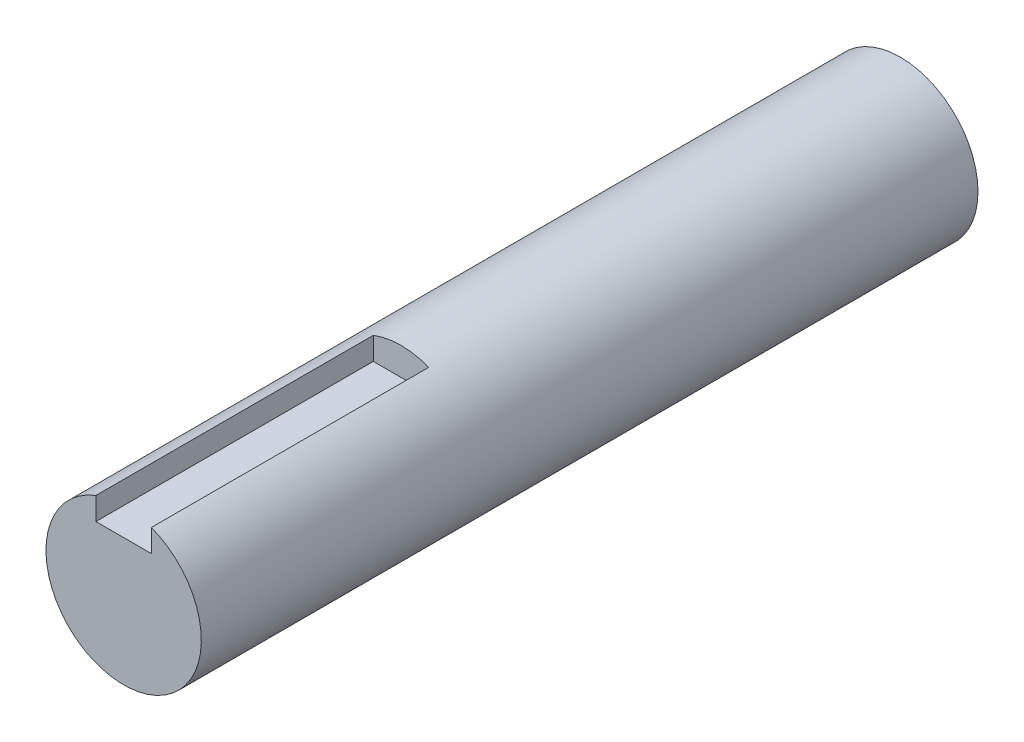
ISO-10303-21;
HEADER;
FILE_DESCRIPTION(('STEP AP214'),'2;1');
FILE_NAME('part.step','',(''),(''),'','','');
FILE_SCHEMA(('AUTOMOTIVE_DESIGN { 1 0 10303 214 1 1 1 1 }'));
ENDSEC;
DATA;
#1=APPLICATION_CONTEXT('core data for automotive mechanical design processes');
#2=APPLICATION_PROTOCOL_DEFINITION('international standard','automotive_design',2000,#1);
#3=PRODUCT_CONTEXT('',#1,'mechanical');
#4=PRODUCT('Part','Part','',(#3));
#5=PRODUCT_RELATED_PRODUCT_CATEGORY('part','',(#4));
#6=PRODUCT_DEFINITION_FORMATION('','',#4);
#7=PRODUCT_DEFINITION_CONTEXT('part definition',#1,'design');
#8=PRODUCT_DEFINITION('design','',#6,#7);
#9=PRODUCT_DEFINITION_SHAPE('','',#8);
#10=(LENGTH_UNIT() NAMED_UNIT(*) SI_UNIT(.MILLI.,.METRE.));
#11=(NAMED_UNIT(*) PLANE_ANGLE_UNIT() SI_UNIT($,.RADIAN.));
#12=(NAMED_UNIT(*) SI_UNIT($,.STERADIAN.) SOLID_ANGLE_UNIT());
#13=UNCERTAINTY_MEASURE_WITH_UNIT(LENGTH_MEASURE(1.E-05),#10,'distance_accuracy_value','');
#14=(GEOMETRIC_REPRESENTATION_CONTEXT(3) GLOBAL_UNCERTAINTY_ASSIGNED_CONTEXT((#13)) GLOBAL_UNIT_ASSIGNED_CONTEXT((#10,
#11,#12)) REPRESENTATION_CONTEXT('',''));
#15=CARTESIAN_POINT('',(0.,0.,0.));
#16=DIRECTION('',(0.,0.,1.));
#17=DIRECTION('',(1.,0.,0.));
#18=AXIS2_PLACEMENT_3D('',#15,#16,#17);
#19=CARTESIAN_POINT('',(0.,0.,70.));
#20=DIRECTION('',(0.,0.,-1.));
#21=DIRECTION('',(-1.,0.,0.));
#22=AXIS2_PLACEMENT_3D('',#19,#20,#21);
#23=CYLINDRICAL_SURFACE('',#22,7.);
#24=CARTESIAN_POINT('',(0.,0.,70.));
#25=DIRECTION('',(0.,0.,1.));
#26=DIRECTION('',(1.,0.,0.));
#27=AXIS2_PLACEMENT_3D('',#24,#25,#26);
#28=CIRCLE('',#27,7.);
#29=CARTESIAN_POINT('',(-2.5,6.53834841531101,70.));
#30=VERTEX_POINT('',#29);
#31=CARTESIAN_POINT('',(2.5,6.53834841531101,70.));
#32=VERTEX_POINT('',#31);
#33=EDGE_CURVE('E11',#30,#32,#28,.T.);
#34=ORIENTED_EDGE('',*,*,#33,.F.);
#35=DIRECTION('',(0.,0.,1.));
#36=VECTOR('',#35,1.);
#37=CARTESIAN_POINT('',(-2.5,6.53834841531101,45.));
#38=LINE('',#37,#36);
#39=CARTESIAN_POINT('',(-2.5,6.53834841531101,45.));
#40=VERTEX_POINT('',#39);
#41=EDGE_CURVE('E74',#40,#30,#38,.T.);
#42=ORIENTED_EDGE('',*,*,#41,.F.);
#43=CARTESIAN_POINT('',(0.,0.,45.));
#44=DIRECTION('',(0.,0.,1.));
#45=DIRECTION('',(1.,0.,0.));
#46=AXIS2_PLACEMENT_3D('',#43,#44,#45);
#47=CIRCLE('',#46,7.);
#48=CARTESIAN_POINT('',(2.5,6.53834841531101,45.));
#49=VERTEX_POINT('',#48);
#50=EDGE_CURVE('E98',#49,#40,#47,.T.);
#51=ORIENTED_EDGE('',*,*,#50,.F.);
#52=DIRECTION('',(0.,0.,1.));
#53=VECTOR('',#52,1.);
#54=CARTESIAN_POINT('',(2.5,6.53834841531101,45.));
#55=LINE('',#54,#53);
#56=EDGE_CURVE('E90',#49,#32,#55,.T.);
#57=ORIENTED_EDGE('',*,*,#56,.T.);
#58=EDGE_LOOP('',(#34,#42,#51,#57));
#59=FACE_BOUND('',#58,.T.);
#60=CARTESIAN_POINT('',(0.,0.,0.));
#61=DIRECTION('',(0.,0.,1.));
#62=DIRECTION('',(1.,0.,0.));
#63=AXIS2_PLACEMENT_3D('',#60,#61,#62);
#64=CIRCLE('',#63,7.);
#65=CARTESIAN_POINT('',(7.,0.,0.));
#66=VERTEX_POINT('',#65);
#67=EDGE_CURVE('E42',#66,#66,#64,.T.);
#68=ORIENTED_EDGE('',*,*,#67,.T.);
#69=EDGE_LOOP('',(#68));
#70=FACE_BOUND('',#69,.T.);
#71=ADVANCED_FACE('F39',(#59,#70),#23,.T.);
#72=CARTESIAN_POINT('',(0.,0.,70.));
#73=DIRECTION('',(0.,0.,1.));
#74=DIRECTION('',(1.,0.,0.));
#75=AXIS2_PLACEMENT_3D('',#72,#73,#74);
#76=PLANE('',#75);
#77=DIRECTION('',(0.,-1.,0.));
#78=VECTOR('',#77,1.);
#79=CARTESIAN_POINT('',(-2.5,4.5,70.));
#80=LINE('',#79,#78);
#81=CARTESIAN_POINT('',(-2.5,4.5,70.));
#82=VERTEX_POINT('',#81);
#83=EDGE_CURVE('E53',#30,#82,#80,.T.);
#84=ORIENTED_EDGE('',*,*,#83,.F.);
#85=ORIENTED_EDGE('',*,*,#33,.T.);
#86=DIRECTION('',(0.,1.,0.));
#87=VECTOR('',#86,1.);
#88=CARTESIAN_POINT('',(2.5,4.5,70.));
#89=LINE('',#88,#87);
#90=CARTESIAN_POINT('',(2.5,4.5,70.));
#91=VERTEX_POINT('',#90);
#92=EDGE_CURVE('E102',#91,#32,#89,.T.);
#93=ORIENTED_EDGE('',*,*,#92,.F.);
#94=DIRECTION('',(1.,0.,0.));
#95=VECTOR('',#94,1.);
#96=CARTESIAN_POINT('',(-2.5,4.5,70.));
#97=LINE('',#96,#95);
#98=EDGE_CURVE('E87',#82,#91,#97,.T.);
#99=ORIENTED_EDGE('',*,*,#98,.F.);
#100=EDGE_LOOP('',(#84,#85,#93,#99));
#101=FACE_BOUND('',#100,.T.);
#102=ADVANCED_FACE('F112',(#101),#76,.T.);
#103=CARTESIAN_POINT('',(0.,0.,0.));
#104=DIRECTION('',(0.,0.,1.));
#105=DIRECTION('',(1.,0.,0.));
#106=AXIS2_PLACEMENT_3D('',#103,#104,#105);
#107=PLANE('',#106);
#108=ORIENTED_EDGE('',*,*,#67,.F.);
#109=EDGE_LOOP('',(#108));
#110=FACE_BOUND('',#109,.T.);
#111=ADVANCED_FACE('F120',(#110),#107,.F.);
#112=CARTESIAN_POINT('',(-2.5,4.5,45.));
#113=DIRECTION('',(-1.,0.,0.));
#114=DIRECTION('',(0.,0.,1.));
#115=AXIS2_PLACEMENT_3D('',#112,#113,#114);
#116=PLANE('',#115);
#117=ORIENTED_EDGE('',*,*,#83,.T.);
#118=DIRECTION('',(0.,0.,1.));
#119=VECTOR('',#118,1.);
#120=CARTESIAN_POINT('',(-2.5,4.5,45.));
#121=LINE('',#120,#119);
#122=CARTESIAN_POINT('',(-2.5,4.5,45.));
#123=VERTEX_POINT('',#122);
#124=EDGE_CURVE('E76',#123,#82,#121,.T.);
#125=ORIENTED_EDGE('',*,*,#124,.F.);
#126=DIRECTION('',(0.,-1.,0.));
#127=VECTOR('',#126,1.);
#128=CARTESIAN_POINT('',(-2.5,4.5,45.));
#129=LINE('',#128,#127);
#130=EDGE_CURVE('E59',#40,#123,#129,.T.);
#131=ORIENTED_EDGE('',*,*,#130,.F.);
#132=ORIENTED_EDGE('',*,*,#41,.T.);
#133=EDGE_LOOP('',(#117,#125,#131,#132));
#134=FACE_BOUND('',#133,.T.);
#135=ADVANCED_FACE('F122',(#134),#116,.F.);
#136=CARTESIAN_POINT('',(2.5,4.5,45.));
#137=DIRECTION('',(1.,0.,0.));
#138=DIRECTION('',(0.,0.,-1.));
#139=AXIS2_PLACEMENT_3D('',#136,#137,#138);
#140=PLANE('',#139);
#141=ORIENTED_EDGE('',*,*,#92,.T.);
#142=ORIENTED_EDGE('',*,*,#56,.F.);
#143=DIRECTION('',(0.,1.,0.));
#144=VECTOR('',#143,1.);
#145=CARTESIAN_POINT('',(2.5,4.5,45.));
#146=LINE('',#145,#144);
#147=CARTESIAN_POINT('',(2.5,4.5,45.));
#148=VERTEX_POINT('',#147);
#149=EDGE_CURVE('E93',#148,#49,#146,.T.);
#150=ORIENTED_EDGE('',*,*,#149,.F.);
#151=DIRECTION('',(0.,0.,1.));
#152=VECTOR('',#151,1.);
#153=CARTESIAN_POINT('',(2.5,4.5,45.));
#154=LINE('',#153,#152);
#155=EDGE_CURVE('E81',#148,#91,#154,.T.);
#156=ORIENTED_EDGE('',*,*,#155,.T.);
#157=EDGE_LOOP('',(#141,#142,#150,#156));
#158=FACE_BOUND('',#157,.T.);
#159=ADVANCED_FACE('F94',(#158),#140,.F.);
#160=CARTESIAN_POINT('',(-2.5,4.5,45.));
#161=DIRECTION('',(0.,-1.,0.));
#162=DIRECTION('',(0.,0.,-1.));
#163=AXIS2_PLACEMENT_3D('',#160,#161,#162);
#164=PLANE('',#163);
#165=ORIENTED_EDGE('',*,*,#98,.T.);
#166=ORIENTED_EDGE('',*,*,#155,.F.);
#167=DIRECTION('',(1.,0.,0.));
#168=VECTOR('',#167,1.);
#169=CARTESIAN_POINT('',(-2.5,4.5,45.));
#170=LINE('',#169,#168);
#171=EDGE_CURVE('E85',#123,#148,#170,.T.);
#172=ORIENTED_EDGE('',*,*,#171,.F.);
#173=ORIENTED_EDGE('',*,*,#124,.T.);
#174=EDGE_LOOP('',(#165,#166,#172,#173));
#175=FACE_BOUND('',#174,.T.);
#176=ADVANCED_FACE('F83',(#175),#164,.F.);
#177=CARTESIAN_POINT('',(0.,0.,45.));
#178=DIRECTION('',(0.,0.,1.));
#179=DIRECTION('',(1.,0.,0.));
#180=AXIS2_PLACEMENT_3D('',#177,#178,#179);
#181=PLANE('',#180);
#182=ORIENTED_EDGE('',*,*,#130,.T.);
#183=ORIENTED_EDGE('',*,*,#171,.T.);
#184=ORIENTED_EDGE('',*,*,#149,.T.);
#185=ORIENTED_EDGE('',*,*,#50,.T.);
#186=EDGE_LOOP('',(#182,#183,#184,#185));
#187=FACE_BOUND('',#186,.T.);
#188=ADVANCED_FACE('F100',(#187),#181,.T.);
#189=CLOSED_SHELL('',(#71,#102,#111,#135,#159,#176,#188));
#190=MANIFOLD_SOLID_BREP('B2',#189);
#191=ADVANCED_BREP_SHAPE_REPRESENTATION('',(#18,#190),#14);
#192=SHAPE_DEFINITION_REPRESENTATION(#9,#191);
ENDSEC;
END-ISO-10303-21;
